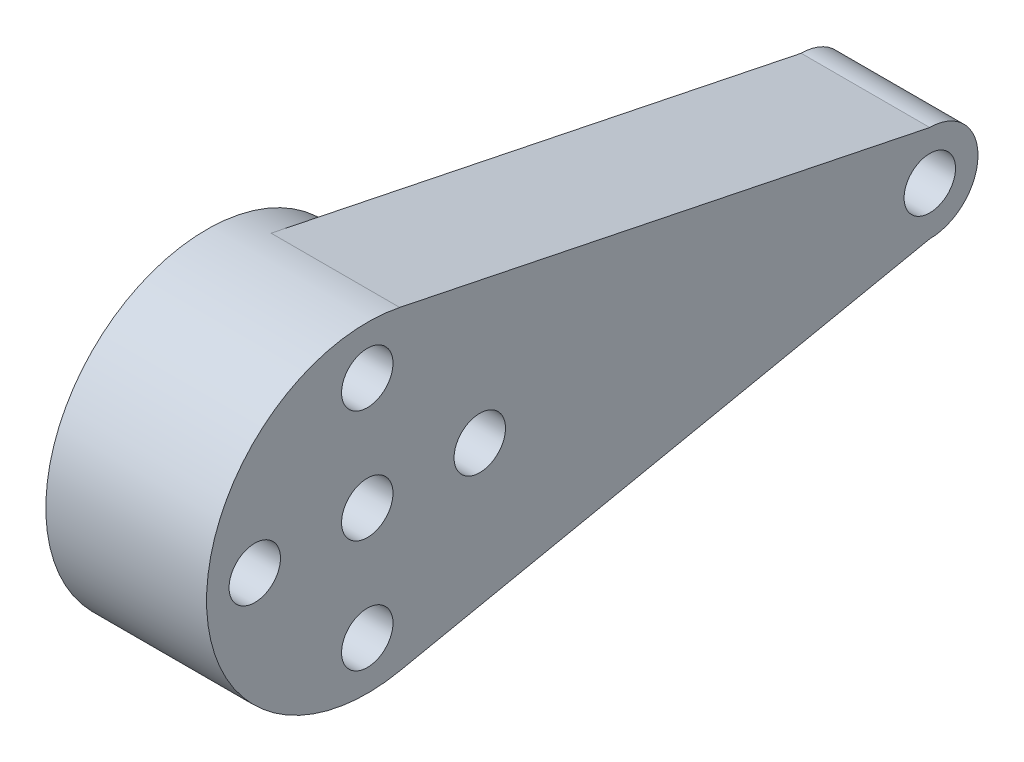
ISO-10303-21;
HEADER;
FILE_DESCRIPTION(('STEP AP214'),'2;1');
FILE_NAME('part.step','',(''),(''),'','','');
FILE_SCHEMA(('AUTOMOTIVE_DESIGN { 1 0 10303 214 1 1 1 1 }'));
ENDSEC;
DATA;
#1=APPLICATION_CONTEXT('core data for automotive mechanical design processes');
#2=APPLICATION_PROTOCOL_DEFINITION('international standard','automotive_design',2000,#1);
#3=PRODUCT_CONTEXT('',#1,'mechanical');
#4=PRODUCT('Part','Part','',(#3));
#5=PRODUCT_RELATED_PRODUCT_CATEGORY('part','',(#4));
#6=PRODUCT_DEFINITION_FORMATION('','',#4);
#7=PRODUCT_DEFINITION_CONTEXT('part definition',#1,'design');
#8=PRODUCT_DEFINITION('design','',#6,#7);
#9=PRODUCT_DEFINITION_SHAPE('','',#8);
#10=(LENGTH_UNIT() NAMED_UNIT(*) SI_UNIT(.MILLI.,.METRE.));
#11=(NAMED_UNIT(*) PLANE_ANGLE_UNIT() SI_UNIT($,.RADIAN.));
#12=(NAMED_UNIT(*) SI_UNIT($,.STERADIAN.) SOLID_ANGLE_UNIT());
#13=UNCERTAINTY_MEASURE_WITH_UNIT(LENGTH_MEASURE(1.E-05),#10,'distance_accuracy_value','');
#14=(GEOMETRIC_REPRESENTATION_CONTEXT(3) GLOBAL_UNCERTAINTY_ASSIGNED_CONTEXT((#13)) GLOBAL_UNIT_ASSIGNED_CONTEXT((#10,
#11,#12)) REPRESENTATION_CONTEXT('',''));
#15=CARTESIAN_POINT('',(0.,0.,0.));
#16=DIRECTION('',(0.,0.,1.));
#17=DIRECTION('',(1.,0.,0.));
#18=AXIS2_PLACEMENT_3D('',#15,#16,#17);
#19=CARTESIAN_POINT('',(0.,0.,0.));
#20=DIRECTION('',(1.,0.,0.));
#21=DIRECTION('',(0.,0.,-1.));
#22=AXIS2_PLACEMENT_3D('',#19,#20,#21);
#23=PLANE('',#22);
#24=CARTESIAN_POINT('',(0.,0.,0.));
#25=DIRECTION('',(1.,0.,0.));
#26=DIRECTION('',(0.,0.,-1.));
#27=AXIS2_PLACEMENT_3D('',#24,#25,#26);
#28=CIRCLE('',#27,10.);
#29=CARTESIAN_POINT('',(0.,0.,-10.));
#30=VERTEX_POINT('',#29);
#31=EDGE_CURVE('E185',#30,#30,#28,.T.);
#32=ORIENTED_EDGE('',*,*,#31,.F.);
#33=EDGE_LOOP('',(#32));
#34=FACE_BOUND('',#33,.T.);
#35=CARTESIAN_POINT('',(0.,7.,0.));
#36=DIRECTION('',(1.,0.,0.));
#37=DIRECTION('',(0.,0.,-1.));
#38=AXIS2_PLACEMENT_3D('',#35,#36,#37);
#39=CIRCLE('',#38,1.6);
#40=CARTESIAN_POINT('',(0.,7.,-1.6));
#41=VERTEX_POINT('',#40);
#42=EDGE_CURVE('E178',#41,#41,#39,.T.);
#43=ORIENTED_EDGE('',*,*,#42,.T.);
#44=EDGE_LOOP('',(#43));
#45=FACE_BOUND('',#44,.T.);
#46=CARTESIAN_POINT('',(0.,0.,0.));
#47=DIRECTION('',(1.,0.,0.));
#48=DIRECTION('',(0.,0.,-1.));
#49=AXIS2_PLACEMENT_3D('',#46,#47,#48);
#50=CIRCLE('',#49,1.6);
#51=CARTESIAN_POINT('',(0.,0.,-1.6));
#52=VERTEX_POINT('',#51);
#53=EDGE_CURVE('E179',#52,#52,#50,.T.);
#54=ORIENTED_EDGE('',*,*,#53,.T.);
#55=EDGE_LOOP('',(#54));
#56=FACE_BOUND('',#55,.T.);
#57=CARTESIAN_POINT('',(0.,0.,-7.));
#58=DIRECTION('',(1.,0.,0.));
#59=DIRECTION('',(0.,0.,-1.));
#60=AXIS2_PLACEMENT_3D('',#57,#58,#59);
#61=CIRCLE('',#60,1.6);
#62=CARTESIAN_POINT('',(0.,0.,-8.6));
#63=VERTEX_POINT('',#62);
#64=EDGE_CURVE('E173',#63,#63,#61,.T.);
#65=ORIENTED_EDGE('',*,*,#64,.T.);
#66=EDGE_LOOP('',(#65));
#67=FACE_BOUND('',#66,.T.);
#68=CARTESIAN_POINT('',(0.,-7.,0.));
#69=DIRECTION('',(1.,0.,0.));
#70=DIRECTION('',(0.,0.,-1.));
#71=AXIS2_PLACEMENT_3D('',#68,#69,#70);
#72=CIRCLE('',#71,1.6);
#73=CARTESIAN_POINT('',(0.,-7.,-1.59999999999995));
#74=VERTEX_POINT('',#73);
#75=EDGE_CURVE('E168',#74,#74,#72,.T.);
#76=ORIENTED_EDGE('',*,*,#75,.T.);
#77=EDGE_LOOP('',(#76));
#78=FACE_BOUND('',#77,.T.);
#79=CARTESIAN_POINT('',(0.,0.,7.));
#80=DIRECTION('',(1.,0.,0.));
#81=DIRECTION('',(0.,0.,-1.));
#82=AXIS2_PLACEMENT_3D('',#79,#80,#81);
#83=CIRCLE('',#82,1.6);
#84=CARTESIAN_POINT('',(0.,0.,5.4));
#85=VERTEX_POINT('',#84);
#86=EDGE_CURVE('E132',#85,#85,#83,.T.);
#87=ORIENTED_EDGE('',*,*,#86,.T.);
#88=EDGE_LOOP('',(#87));
#89=FACE_BOUND('',#88,.T.);
#90=ADVANCED_FACE('F43',(#34,#45,#56,#67,#78,#89),#23,.F.);
#91=CARTESIAN_POINT('',(2.,0.,0.));
#92=DIRECTION('',(-1.,0.,0.));
#93=DIRECTION('',(0.,0.,1.));
#94=AXIS2_PLACEMENT_3D('',#91,#92,#93);
#95=CYLINDRICAL_SURFACE('',#94,10.);
#96=CARTESIAN_POINT('',(1.9999,0.,-10.));
#97=CARTESIAN_POINT('',(1.9999,1.72607800525928,-10.));
#98=CARTESIAN_POINT('',(1.9999,3.35286894984645,-9.421160746169));
#99=CARTESIAN_POINT('',(1.9999,4.97878535943178,-8.8426326664256));
#100=CARTESIAN_POINT('',(1.9999,6.31758346746846,-7.75165396103111));
#101=CARTESIAN_POINT('',(1.9999,7.65541256940198,-6.66146489301179));
#102=CARTESIAN_POINT('',(1.9999,8.55092492502555,-5.18475485694134));
#103=CARTESIAN_POINT('',(1.9999,9.44595602041671,-3.70883842445513));
#104=CARTESIAN_POINT('',(1.9999,9.7943441819493,-2.01762782631385));
#105=B_SPLINE_CURVE_WITH_KNOTS('',2,(#96,#97,#98,#99,#100,#101,#102,#103,#104),.UNSPECIFIED.,
.F.,.F.,(3,2,2,2,3),(0.,0.25,0.5,0.75,1.),.UNSPECIFIED.);
#106=CARTESIAN_POINT('',(1.99995,0.,-10.));
#107=VERTEX_POINT('',#106);
#108=CARTESIAN_POINT('',(2.,9.7954315863185,-2.01700761234505));
#109=VERTEX_POINT('',#108);
#110=EDGE_CURVE('E11',#107,#109,#105,.T.);
#111=ORIENTED_EDGE('',*,*,#110,.F.);
#112=CARTESIAN_POINT('',(1.9999,-9.79434422069523,-2.01762763822612));
#113=CARTESIAN_POINT('',(1.9999,-9.44608594679163,-3.70820787597304));
#114=CARTESIAN_POINT('',(1.9999,-8.55092499970044,-5.18475473378424));
#115=CARTESIAN_POINT('',(1.9999,-7.65624527582013,-6.66050782526523));
#116=CARTESIAN_POINT('',(1.9999,-6.31758354189871,-7.75165390037059));
#117=CARTESIAN_POINT('',(1.9999,-4.97989071536089,-8.84201021697165));
#118=CARTESIAN_POINT('',(1.9999,-3.35286899507676,-9.42116073007212));
#119=CARTESIAN_POINT('',(1.9999,-1.72672165785994,-10.));
#120=CARTESIAN_POINT('',(1.9999,0.,-10.));
#121=B_SPLINE_CURVE_WITH_KNOTS('',2,(#112,#113,#114,#115,#116,#117,#118,#119,#120),
.UNSPECIFIED.,.F.,.F.,(3,2,2,2,3),(0.,0.25,0.5,0.75,1.),.UNSPECIFIED.);
#122=CARTESIAN_POINT('',(2.,-9.79549341498613,-2.01669662968373));
#123=VERTEX_POINT('',#122);
#124=EDGE_CURVE('E52',#123,#107,#121,.T.);
#125=ORIENTED_EDGE('',*,*,#124,.F.);
#126=DIRECTION('',(1.,0.,0.));
#127=VECTOR('',#126,1.);
#128=CARTESIAN_POINT('',(1.9999,-9.79434422069523,-2.01762763822612));
#129=LINE('',#128,#127);
#130=CARTESIAN_POINT('',(10.,-9.79434422069523,-2.01762763822612));
#131=VERTEX_POINT('',#130);
#132=EDGE_CURVE('E83',#123,#131,#129,.T.);
#133=ORIENTED_EDGE('',*,*,#132,.T.);
#134=CARTESIAN_POINT('',(10.,0.,0.));
#135=DIRECTION('',(1.,0.,0.));
#136=DIRECTION('',(0.,0.,-1.));
#137=AXIS2_PLACEMENT_3D('',#134,#135,#136);
#138=CIRCLE('',#137,10.);
#139=CARTESIAN_POINT('',(10.,9.79434422069523,-2.01762763822612));
#140=VERTEX_POINT('',#139);
#141=EDGE_CURVE('E87',#140,#131,#138,.T.);
#142=ORIENTED_EDGE('',*,*,#141,.F.);
#143=DIRECTION('',(1.,0.,0.));
#144=VECTOR('',#143,1.);
#145=CARTESIAN_POINT('',(1.9999,9.79434422069523,-2.01762763822612));
#146=LINE('',#145,#144);
#147=EDGE_CURVE('E126',#109,#140,#146,.T.);
#148=ORIENTED_EDGE('',*,*,#147,.F.);
#149=EDGE_LOOP('',(#111,#125,#133,#142,#148));
#150=FACE_BOUND('',#149,.T.);
#151=ORIENTED_EDGE('',*,*,#31,.T.);
#152=EDGE_LOOP('',(#151));
#153=FACE_BOUND('',#152,.T.);
#154=ADVANCED_FACE('F44',(#150,#153),#95,.T.);
#155=CARTESIAN_POINT('',(2.,7.,0.));
#156=DIRECTION('',(-1.,0.,0.));
#157=DIRECTION('',(0.,0.,1.));
#158=AXIS2_PLACEMENT_3D('',#155,#156,#157);
#159=CYLINDRICAL_SURFACE('',#158,1.6);
#160=ORIENTED_EDGE('',*,*,#42,.F.);
#161=EDGE_LOOP('',(#160));
#162=FACE_BOUND('',#161,.T.);
#163=CARTESIAN_POINT('',(10.,7.,0.));
#164=DIRECTION('',(1.,0.,0.));
#165=DIRECTION('',(0.,0.,-1.));
#166=AXIS2_PLACEMENT_3D('',#163,#164,#165);
#167=CIRCLE('',#166,1.6);
#168=CARTESIAN_POINT('',(10.,7.,-1.6));
#169=VERTEX_POINT('',#168);
#170=EDGE_CURVE('E243',#169,#169,#167,.F.);
#171=ORIENTED_EDGE('',*,*,#170,.F.);
#172=EDGE_LOOP('',(#171));
#173=FACE_BOUND('',#172,.T.);
#174=ADVANCED_FACE('F212',(#162,#173),#159,.F.);
#175=CARTESIAN_POINT('',(2.,0.,0.));
#176=DIRECTION('',(-1.,0.,0.));
#177=DIRECTION('',(0.,0.,1.));
#178=AXIS2_PLACEMENT_3D('',#175,#176,#177);
#179=CYLINDRICAL_SURFACE('',#178,1.6);
#180=ORIENTED_EDGE('',*,*,#53,.F.);
#181=EDGE_LOOP('',(#180));
#182=FACE_BOUND('',#181,.T.);
#183=CARTESIAN_POINT('',(10.,0.,0.));
#184=DIRECTION('',(1.,0.,0.));
#185=DIRECTION('',(0.,0.,-1.));
#186=AXIS2_PLACEMENT_3D('',#183,#184,#185);
#187=CIRCLE('',#186,1.6);
#188=CARTESIAN_POINT('',(10.,0.,-1.6));
#189=VERTEX_POINT('',#188);
#190=EDGE_CURVE('E246',#189,#189,#187,.F.);
#191=ORIENTED_EDGE('',*,*,#190,.F.);
#192=EDGE_LOOP('',(#191));
#193=FACE_BOUND('',#192,.T.);
#194=ADVANCED_FACE('F219',(#182,#193),#179,.F.);
#195=CARTESIAN_POINT('',(2.,0.,-7.));
#196=DIRECTION('',(-1.,0.,0.));
#197=DIRECTION('',(0.,0.,1.));
#198=AXIS2_PLACEMENT_3D('',#195,#196,#197);
#199=CYLINDRICAL_SURFACE('',#198,1.6);
#200=ORIENTED_EDGE('',*,*,#64,.F.);
#201=EDGE_LOOP('',(#200));
#202=FACE_BOUND('',#201,.T.);
#203=CARTESIAN_POINT('',(10.,0.,-7.));
#204=DIRECTION('',(1.,0.,0.));
#205=DIRECTION('',(0.,0.,-1.));
#206=AXIS2_PLACEMENT_3D('',#203,#204,#205);
#207=CIRCLE('',#206,1.6);
#208=CARTESIAN_POINT('',(10.,0.,-8.6));
#209=VERTEX_POINT('',#208);
#210=EDGE_CURVE('E103',#209,#209,#207,.F.);
#211=ORIENTED_EDGE('',*,*,#210,.F.);
#212=EDGE_LOOP('',(#211));
#213=FACE_BOUND('',#212,.T.);
#214=ADVANCED_FACE('F221',(#202,#213),#199,.F.);
#215=CARTESIAN_POINT('',(2.,-7.,0.));
#216=DIRECTION('',(-1.,0.,0.));
#217=DIRECTION('',(0.,0.,1.));
#218=AXIS2_PLACEMENT_3D('',#215,#216,#217);
#219=CYLINDRICAL_SURFACE('',#218,1.6);
#220=ORIENTED_EDGE('',*,*,#75,.F.);
#221=EDGE_LOOP('',(#220));
#222=FACE_BOUND('',#221,.T.);
#223=CARTESIAN_POINT('',(10.,-7.,0.));
#224=DIRECTION('',(1.,0.,0.));
#225=DIRECTION('',(0.,0.,-1.));
#226=AXIS2_PLACEMENT_3D('',#223,#224,#225);
#227=CIRCLE('',#226,1.6);
#228=CARTESIAN_POINT('',(10.,-7.,-1.59999999999995));
#229=VERTEX_POINT('',#228);
#230=EDGE_CURVE('E114',#229,#229,#227,.F.);
#231=ORIENTED_EDGE('',*,*,#230,.F.);
#232=EDGE_LOOP('',(#231));
#233=FACE_BOUND('',#232,.T.);
#234=ADVANCED_FACE('F228',(#222,#233),#219,.F.);
#235=CARTESIAN_POINT('',(2.,0.,7.));
#236=DIRECTION('',(-1.,0.,0.));
#237=DIRECTION('',(0.,0.,1.));
#238=AXIS2_PLACEMENT_3D('',#235,#236,#237);
#239=CYLINDRICAL_SURFACE('',#238,1.6);
#240=ORIENTED_EDGE('',*,*,#86,.F.);
#241=EDGE_LOOP('',(#240));
#242=FACE_BOUND('',#241,.T.);
#243=CARTESIAN_POINT('',(10.,0.,7.));
#244=DIRECTION('',(1.,0.,0.));
#245=DIRECTION('',(0.,0.,-1.));
#246=AXIS2_PLACEMENT_3D('',#243,#244,#245);
#247=CIRCLE('',#246,1.6);
#248=CARTESIAN_POINT('',(10.,0.,5.4));
#249=VERTEX_POINT('',#248);
#250=EDGE_CURVE('E242',#249,#249,#247,.F.);
#251=ORIENTED_EDGE('',*,*,#250,.F.);
#252=EDGE_LOOP('',(#251));
#253=FACE_BOUND('',#252,.T.);
#254=ADVANCED_FACE('F208',(#242,#253),#239,.F.);
#255=CARTESIAN_POINT('',(1.9999,9.79434422069523,-2.01762763822612));
#256=DIRECTION('',(0.,-0.979434422069523,0.201762763822612));
#257=DIRECTION('',(0.,-0.201762763822612,-0.979434422069523));
#258=AXIS2_PLACEMENT_3D('',#255,#256,#257);
#259=PLANE('',#258);
#260=ORIENTED_EDGE('',*,*,#147,.T.);
#261=DIRECTION('',(0.,-0.201762763822612,-0.979434422069523));
#262=VECTOR('',#261,1.);
#263=CARTESIAN_POINT('',(10.,9.79434422069523,-2.01762763822612));
#264=LINE('',#263,#262);
#265=CARTESIAN_POINT('',(10.,3.,-35.));
#266=VERTEX_POINT('',#265);
#267=EDGE_CURVE('E105',#140,#266,#264,.T.);
#268=ORIENTED_EDGE('',*,*,#267,.T.);
#269=DIRECTION('',(1.,0.,0.));
#270=VECTOR('',#269,1.);
#271=CARTESIAN_POINT('',(1.9999,3.,-35.));
#272=LINE('',#271,#270);
#273=CARTESIAN_POINT('',(1.9999,3.,-35.));
#274=VERTEX_POINT('',#273);
#275=EDGE_CURVE('E127',#274,#266,#272,.T.);
#276=ORIENTED_EDGE('',*,*,#275,.F.);
#277=DIRECTION('',(0.,-0.201762763822612,-0.979434422069523));
#278=VECTOR('',#277,1.);
#279=CARTESIAN_POINT('',(1.9999,9.79434422069523,-2.01762763822612));
#280=LINE('',#279,#278);
#281=EDGE_CURVE('E125',#109,#274,#280,.T.);
#282=ORIENTED_EDGE('',*,*,#281,.F.);
#283=EDGE_LOOP('',(#260,#268,#276,#282));
#284=FACE_BOUND('',#283,.T.);
#285=ADVANCED_FACE('F198',(#284),#259,.F.);
#286=CARTESIAN_POINT('',(1.9999,0.,-35.));
#287=DIRECTION('',(1.,0.,0.));
#288=DIRECTION('',(0.,0.,-1.));
#289=AXIS2_PLACEMENT_3D('',#286,#287,#288);
#290=CYLINDRICAL_SURFACE('',#289,3.);
#291=ORIENTED_EDGE('',*,*,#275,.T.);
#292=CARTESIAN_POINT('',(10.,0.,-35.));
#293=DIRECTION('',(1.,0.,0.));
#294=DIRECTION('',(0.,0.,-1.));
#295=AXIS2_PLACEMENT_3D('',#292,#293,#294);
#296=CIRCLE('',#295,3.);
#297=CARTESIAN_POINT('',(10.,-3.,-35.));
#298=VERTEX_POINT('',#297);
#299=EDGE_CURVE('E110',#298,#266,#296,.T.);
#300=ORIENTED_EDGE('',*,*,#299,.F.);
#301=DIRECTION('',(1.,0.,0.));
#302=VECTOR('',#301,1.);
#303=CARTESIAN_POINT('',(1.9999,-3.,-35.));
#304=LINE('',#303,#302);
#305=CARTESIAN_POINT('',(1.9999,-3.,-35.));
#306=VERTEX_POINT('',#305);
#307=EDGE_CURVE('E95',#306,#298,#304,.T.);
#308=ORIENTED_EDGE('',*,*,#307,.F.);
#309=CARTESIAN_POINT('',(1.9999,0.,-35.));
#310=DIRECTION('',(1.,0.,0.));
#311=DIRECTION('',(0.,0.,-1.));
#312=AXIS2_PLACEMENT_3D('',#309,#310,#311);
#313=CIRCLE('',#312,3.);
#314=EDGE_CURVE('E116',#306,#274,#313,.T.);
#315=ORIENTED_EDGE('',*,*,#314,.T.);
#316=EDGE_LOOP('',(#291,#300,#308,#315));
#317=FACE_BOUND('',#316,.T.);
#318=ADVANCED_FACE('F199',(#317),#290,.T.);
#319=CARTESIAN_POINT('',(1.9999,-9.79434422069523,-2.01762763822612));
#320=DIRECTION('',(0.,0.979434422069523,0.201762763822612));
#321=DIRECTION('',(0.,-0.201762763822612,0.979434422069523));
#322=AXIS2_PLACEMENT_3D('',#319,#320,#321);
#323=PLANE('',#322);
#324=ORIENTED_EDGE('',*,*,#307,.T.);
#325=DIRECTION('',(0.,-0.201762763822612,0.979434422069523));
#326=VECTOR('',#325,1.);
#327=CARTESIAN_POINT('',(10.,-9.79434422069523,-2.01762763822612));
#328=LINE('',#327,#326);
#329=EDGE_CURVE('E99',#298,#131,#328,.T.);
#330=ORIENTED_EDGE('',*,*,#329,.T.);
#331=ORIENTED_EDGE('',*,*,#132,.F.);
#332=DIRECTION('',(0.,-0.201762763822612,0.979434422069523));
#333=VECTOR('',#332,1.);
#334=CARTESIAN_POINT('',(1.9999,-9.79434422069523,-2.01762763822612));
#335=LINE('',#334,#333);
#336=EDGE_CURVE('E119',#306,#123,#335,.T.);
#337=ORIENTED_EDGE('',*,*,#336,.F.);
#338=EDGE_LOOP('',(#324,#330,#331,#337));
#339=FACE_BOUND('',#338,.T.);
#340=ADVANCED_FACE('F104',(#339),#323,.F.);
#341=CARTESIAN_POINT('',(1.9999,0.,-35.));
#342=DIRECTION('',(1.,0.,0.));
#343=DIRECTION('',(0.,0.,-1.));
#344=AXIS2_PLACEMENT_3D('',#341,#342,#343);
#345=CYLINDRICAL_SURFACE('',#344,1.60000000000001);
#346=CARTESIAN_POINT('',(1.9999,0.,-35.));
#347=DIRECTION('',(1.,0.,0.));
#348=DIRECTION('',(0.,0.,-1.));
#349=AXIS2_PLACEMENT_3D('',#346,#347,#348);
#350=CIRCLE('',#349,1.60000000000001);
#351=CARTESIAN_POINT('',(1.9999,0.,-36.6));
#352=VERTEX_POINT('',#351);
#353=EDGE_CURVE('E91',#352,#352,#350,.T.);
#354=ORIENTED_EDGE('',*,*,#353,.F.);
#355=EDGE_LOOP('',(#354));
#356=FACE_BOUND('',#355,.T.);
#357=CARTESIAN_POINT('',(10.,0.,-35.));
#358=DIRECTION('',(1.,0.,0.));
#359=DIRECTION('',(0.,0.,-1.));
#360=AXIS2_PLACEMENT_3D('',#357,#358,#359);
#361=CIRCLE('',#360,1.60000000000001);
#362=CARTESIAN_POINT('',(10.,0.,-36.6));
#363=VERTEX_POINT('',#362);
#364=EDGE_CURVE('E117',#363,#363,#361,.T.);
#365=ORIENTED_EDGE('',*,*,#364,.T.);
#366=EDGE_LOOP('',(#365));
#367=FACE_BOUND('',#366,.T.);
#368=ADVANCED_FACE('F160',(#356,#367),#345,.F.);
#369=CARTESIAN_POINT('',(1.9999,0.,0.));
#370=DIRECTION('',(1.,0.,0.));
#371=DIRECTION('',(0.,0.,-1.));
#372=AXIS2_PLACEMENT_3D('',#369,#370,#371);
#373=PLANE('',#372);
#374=ORIENTED_EDGE('',*,*,#124,.T.);
#375=ORIENTED_EDGE('',*,*,#110,.T.);
#376=ORIENTED_EDGE('',*,*,#281,.T.);
#377=ORIENTED_EDGE('',*,*,#314,.F.);
#378=ORIENTED_EDGE('',*,*,#336,.T.);
#379=EDGE_LOOP('',(#374,#375,#376,#377,#378));
#380=FACE_BOUND('',#379,.T.);
#381=ORIENTED_EDGE('',*,*,#353,.T.);
#382=EDGE_LOOP('',(#381));
#383=FACE_BOUND('',#382,.T.);
#384=ADVANCED_FACE('F150',(#380,#383),#373,.F.);
#385=CARTESIAN_POINT('',(10.,0.,0.));
#386=DIRECTION('',(1.,0.,0.));
#387=DIRECTION('',(0.,0.,-1.));
#388=AXIS2_PLACEMENT_3D('',#385,#386,#387);
#389=PLANE('',#388);
#390=ORIENTED_EDGE('',*,*,#190,.T.);
#391=EDGE_LOOP('',(#390));
#392=FACE_BOUND('',#391,.T.);
#393=ORIENTED_EDGE('',*,*,#170,.T.);
#394=EDGE_LOOP('',(#393));
#395=FACE_BOUND('',#394,.T.);
#396=ORIENTED_EDGE('',*,*,#250,.T.);
#397=EDGE_LOOP('',(#396));
#398=FACE_BOUND('',#397,.T.);
#399=ORIENTED_EDGE('',*,*,#210,.T.);
#400=EDGE_LOOP('',(#399));
#401=FACE_BOUND('',#400,.T.);
#402=ORIENTED_EDGE('',*,*,#141,.T.);
#403=ORIENTED_EDGE('',*,*,#329,.F.);
#404=ORIENTED_EDGE('',*,*,#299,.T.);
#405=ORIENTED_EDGE('',*,*,#267,.F.);
#406=EDGE_LOOP('',(#402,#403,#404,#405));
#407=FACE_BOUND('',#406,.T.);
#408=ORIENTED_EDGE('',*,*,#230,.T.);
#409=EDGE_LOOP('',(#408));
#410=FACE_BOUND('',#409,.T.);
#411=ORIENTED_EDGE('',*,*,#364,.F.);
#412=EDGE_LOOP('',(#411));
#413=FACE_BOUND('',#412,.T.);
#414=ADVANCED_FACE('F100',(#392,#395,#398,#401,#407,#410,#413),#389,.T.);
#415=CLOSED_SHELL('',(#90,#154,#174,#194,#214,#234,#254,#285,#318,#340,#368,#384,#414));
#416=MANIFOLD_SOLID_BREP('B2',#415);
#417=ADVANCED_BREP_SHAPE_REPRESENTATION('',(#18,#416),#14);
#418=SHAPE_DEFINITION_REPRESENTATION(#9,#417);
ENDSEC;
END-ISO-10303-21;
